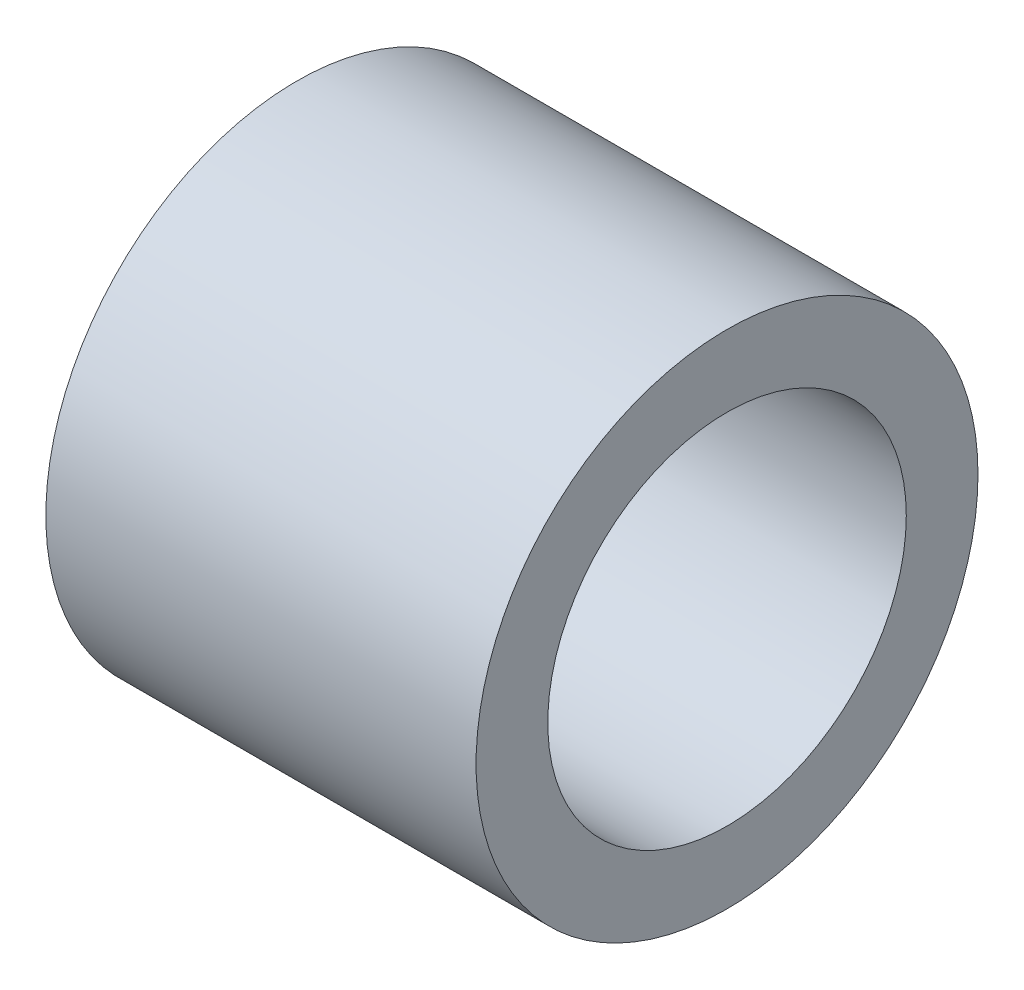
ISO-10303-21;
HEADER;
FILE_DESCRIPTION(('STEP AP214'),'2;1');
FILE_NAME('part.step','',(''),(''),'','','');
FILE_SCHEMA(('AUTOMOTIVE_DESIGN { 1 0 10303 214 1 1 1 1 }'));
ENDSEC;
DATA;
#1=APPLICATION_CONTEXT('core data for automotive mechanical design processes');
#2=APPLICATION_PROTOCOL_DEFINITION('international standard','automotive_design',2000,#1);
#3=PRODUCT_CONTEXT('',#1,'mechanical');
#4=PRODUCT('Part','Part','',(#3));
#5=PRODUCT_RELATED_PRODUCT_CATEGORY('part','',(#4));
#6=PRODUCT_DEFINITION_FORMATION('','',#4);
#7=PRODUCT_DEFINITION_CONTEXT('part definition',#1,'design');
#8=PRODUCT_DEFINITION('design','',#6,#7);
#9=PRODUCT_DEFINITION_SHAPE('','',#8);
#10=(LENGTH_UNIT() NAMED_UNIT(*) SI_UNIT(.MILLI.,.METRE.));
#11=(NAMED_UNIT(*) PLANE_ANGLE_UNIT() SI_UNIT($,.RADIAN.));
#12=(NAMED_UNIT(*) SI_UNIT($,.STERADIAN.) SOLID_ANGLE_UNIT());
#13=UNCERTAINTY_MEASURE_WITH_UNIT(LENGTH_MEASURE(1.E-05),#10,'distance_accuracy_value','');
#14=(GEOMETRIC_REPRESENTATION_CONTEXT(3) GLOBAL_UNCERTAINTY_ASSIGNED_CONTEXT((#13)) GLOBAL_UNIT_ASSIGNED_CONTEXT((#10,
#11,#12)) REPRESENTATION_CONTEXT('',''));
#15=CARTESIAN_POINT('',(0.,0.,0.));
#16=DIRECTION('',(0.,0.,1.));
#17=DIRECTION('',(1.,0.,0.));
#18=AXIS2_PLACEMENT_3D('',#15,#16,#17);
#19=CARTESIAN_POINT('',(24.,0.,0.));
#20=DIRECTION('',(1.,0.,0.));
#21=DIRECTION('',(0.,0.,-1.));
#22=AXIS2_PLACEMENT_3D('',#19,#20,#21);
#23=PLANE('',#22);
#24=CARTESIAN_POINT('',(24.,0.,0.));
#25=DIRECTION('',(1.,0.,0.));
#26=DIRECTION('',(0.,0.,-1.));
#27=AXIS2_PLACEMENT_3D('',#24,#25,#26);
#28=CIRCLE('',#27,14.);
#29=CARTESIAN_POINT('',(24.,0.,-14.));
#30=VERTEX_POINT('',#29);
#31=EDGE_CURVE('E11',#30,#30,#28,.T.);
#32=ORIENTED_EDGE('',*,*,#31,.T.);
#33=EDGE_LOOP('',(#32));
#34=FACE_BOUND('',#33,.T.);
#35=CARTESIAN_POINT('',(24.,0.,0.));
#36=DIRECTION('',(1.,0.,0.));
#37=DIRECTION('',(0.,0.,-1.));
#38=AXIS2_PLACEMENT_3D('',#35,#36,#37);
#39=CIRCLE('',#38,10.);
#40=CARTESIAN_POINT('',(24.,0.,-10.));
#41=VERTEX_POINT('',#40);
#42=EDGE_CURVE('E47',#41,#41,#39,.T.);
#43=ORIENTED_EDGE('',*,*,#42,.F.);
#44=EDGE_LOOP('',(#43));
#45=FACE_BOUND('',#44,.T.);
#46=ADVANCED_FACE('F36',(#34,#45),#23,.T.);
#47=CARTESIAN_POINT('',(0.,0.,0.));
#48=DIRECTION('',(1.,0.,0.));
#49=DIRECTION('',(0.,0.,-1.));
#50=AXIS2_PLACEMENT_3D('',#47,#48,#49);
#51=PLANE('',#50);
#52=CARTESIAN_POINT('',(0.,0.,0.));
#53=DIRECTION('',(1.,0.,0.));
#54=DIRECTION('',(0.,0.,-1.));
#55=AXIS2_PLACEMENT_3D('',#52,#53,#54);
#56=CIRCLE('',#55,14.);
#57=CARTESIAN_POINT('',(0.,0.,-14.));
#58=VERTEX_POINT('',#57);
#59=EDGE_CURVE('E40',#58,#58,#56,.T.);
#60=ORIENTED_EDGE('',*,*,#59,.F.);
#61=EDGE_LOOP('',(#60));
#62=FACE_BOUND('',#61,.T.);
#63=CARTESIAN_POINT('',(0.,0.,0.));
#64=DIRECTION('',(1.,0.,0.));
#65=DIRECTION('',(0.,0.,-1.));
#66=AXIS2_PLACEMENT_3D('',#63,#64,#65);
#67=CIRCLE('',#66,10.);
#68=CARTESIAN_POINT('',(0.,0.,-10.));
#69=VERTEX_POINT('',#68);
#70=EDGE_CURVE('E49',#69,#69,#67,.T.);
#71=ORIENTED_EDGE('',*,*,#70,.T.);
#72=EDGE_LOOP('',(#71));
#73=FACE_BOUND('',#72,.T.);
#74=ADVANCED_FACE('F59',(#62,#73),#51,.F.);
#75=CARTESIAN_POINT('',(24.,0.,0.));
#76=DIRECTION('',(-1.,0.,0.));
#77=DIRECTION('',(0.,0.,1.));
#78=AXIS2_PLACEMENT_3D('',#75,#76,#77);
#79=CYLINDRICAL_SURFACE('',#78,14.);
#80=ORIENTED_EDGE('',*,*,#31,.F.);
#81=EDGE_LOOP('',(#80));
#82=FACE_BOUND('',#81,.T.);
#83=ORIENTED_EDGE('',*,*,#59,.T.);
#84=EDGE_LOOP('',(#83));
#85=FACE_BOUND('',#84,.T.);
#86=ADVANCED_FACE('F38',(#82,#85),#79,.T.);
#87=CARTESIAN_POINT('',(24.,0.,0.));
#88=DIRECTION('',(-1.,0.,0.));
#89=DIRECTION('',(0.,0.,1.));
#90=AXIS2_PLACEMENT_3D('',#87,#88,#89);
#91=CYLINDRICAL_SURFACE('',#90,10.);
#92=ORIENTED_EDGE('',*,*,#42,.T.);
#93=EDGE_LOOP('',(#92));
#94=FACE_BOUND('',#93,.T.);
#95=ORIENTED_EDGE('',*,*,#70,.F.);
#96=EDGE_LOOP('',(#95));
#97=FACE_BOUND('',#96,.T.);
#98=ADVANCED_FACE('F55',(#94,#97),#91,.F.);
#99=CLOSED_SHELL('',(#46,#74,#86,#98));
#100=MANIFOLD_SOLID_BREP('B2',#99);
#101=ADVANCED_BREP_SHAPE_REPRESENTATION('',(#18,#100),#14);
#102=SHAPE_DEFINITION_REPRESENTATION(#9,#101);
ENDSEC;
END-ISO-10303-21;
